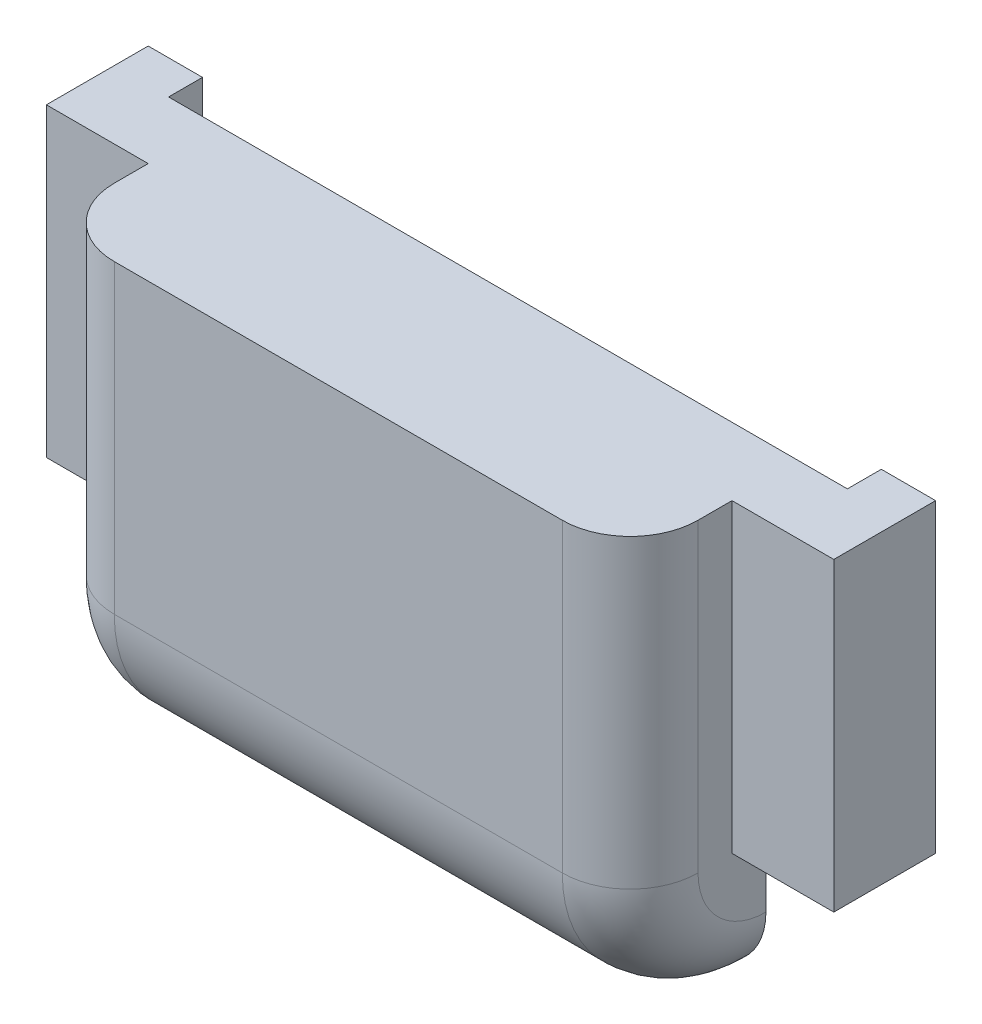
ISO-10303-21;
HEADER;
FILE_DESCRIPTION(('STEP AP214'),'2;1');
FILE_NAME('part.step','',(''),(''),'','','');
FILE_SCHEMA(('AUTOMOTIVE_DESIGN { 1 0 10303 214 1 1 1 1 }'));
ENDSEC;
DATA;
#1=APPLICATION_CONTEXT('core data for automotive mechanical design processes');
#2=APPLICATION_PROTOCOL_DEFINITION('international standard','automotive_design',2000,#1);
#3=PRODUCT_CONTEXT('',#1,'mechanical');
#4=PRODUCT('Part','Part','',(#3));
#5=PRODUCT_RELATED_PRODUCT_CATEGORY('part','',(#4));
#6=PRODUCT_DEFINITION_FORMATION('','',#4);
#7=PRODUCT_DEFINITION_CONTEXT('part definition',#1,'design');
#8=PRODUCT_DEFINITION('design','',#6,#7);
#9=PRODUCT_DEFINITION_SHAPE('','',#8);
#10=(LENGTH_UNIT() NAMED_UNIT(*) SI_UNIT(.MILLI.,.METRE.));
#11=(NAMED_UNIT(*) PLANE_ANGLE_UNIT() SI_UNIT($,.RADIAN.));
#12=(NAMED_UNIT(*) SI_UNIT($,.STERADIAN.) SOLID_ANGLE_UNIT());
#13=UNCERTAINTY_MEASURE_WITH_UNIT(LENGTH_MEASURE(1.E-05),#10,'distance_accuracy_value','');
#14=(GEOMETRIC_REPRESENTATION_CONTEXT(3) GLOBAL_UNCERTAINTY_ASSIGNED_CONTEXT((#13)) GLOBAL_UNIT_ASSIGNED_CONTEXT((#10,
#11,#12)) REPRESENTATION_CONTEXT('',''));
#15=CARTESIAN_POINT('',(0.,0.,0.));
#16=DIRECTION('',(0.,0.,1.));
#17=DIRECTION('',(1.,0.,0.));
#18=AXIS2_PLACEMENT_3D('',#15,#16,#17);
#19=CARTESIAN_POINT('',(0.,0.,0.));
#20=DIRECTION('',(0.,0.,1.));
#21=DIRECTION('',(1.,0.,0.));
#22=AXIS2_PLACEMENT_3D('',#19,#20,#21);
#23=PLANE('',#22);
#24=DIRECTION('',(-1.,0.,0.));
#25=VECTOR('',#24,1.);
#26=CARTESIAN_POINT('',(5.8,-1.25,0.));
#27=LINE('',#26,#25);
#28=CARTESIAN_POINT('',(5.8,-1.25,0.));
#29=VERTEX_POINT('',#28);
#30=CARTESIAN_POINT('',(5.,-1.25,0.));
#31=VERTEX_POINT('',#30);
#32=EDGE_CURVE('E257',#29,#31,#27,.T.);
#33=ORIENTED_EDGE('',*,*,#32,.T.);
#34=DIRECTION('',(0.,-1.,0.));
#35=VECTOR('',#34,1.);
#36=CARTESIAN_POINT('',(5.,3.25,0.));
#37=LINE('',#36,#35);
#38=CARTESIAN_POINT('',(5.,3.25,0.));
#39=VERTEX_POINT('',#38);
#40=EDGE_CURVE('E581',#39,#31,#37,.T.);
#41=ORIENTED_EDGE('',*,*,#40,.F.);
#42=DIRECTION('',(-1.,0.,0.));
#43=VECTOR('',#42,1.);
#44=CARTESIAN_POINT('',(-4.3,3.25,0.));
#45=LINE('',#44,#43);
#46=CARTESIAN_POINT('',(5.8,3.25,0.));
#47=VERTEX_POINT('',#46);
#48=EDGE_CURVE('E274',#47,#39,#45,.T.);
#49=ORIENTED_EDGE('',*,*,#48,.F.);
#50=DIRECTION('',(0.,1.,0.));
#51=VECTOR('',#50,1.);
#52=CARTESIAN_POINT('',(5.8,-1.25,0.));
#53=LINE('',#52,#51);
#54=EDGE_CURVE('E237',#29,#47,#53,.T.);
#55=ORIENTED_EDGE('',*,*,#54,.F.);
#56=EDGE_LOOP('',(#33,#41,#49,#55));
#57=FACE_BOUND('',#56,.T.);
#58=ADVANCED_FACE('F41',(#57),#23,.F.);
#59=CARTESIAN_POINT('',(-4.3,3.25,3.));
#60=DIRECTION('',(1.,0.,0.));
#61=DIRECTION('',(0.,0.,-1.));
#62=AXIS2_PLACEMENT_3D('',#59,#60,#61);
#63=PLANE('',#62);
#64=DIRECTION('',(0.,1.,0.));
#65=VECTOR('',#64,1.);
#66=CARTESIAN_POINT('',(-4.3,-2.25,1.));
#67=LINE('',#66,#65);
#68=CARTESIAN_POINT('',(-4.3,-2.25,1.));
#69=VERTEX_POINT('',#68);
#70=CARTESIAN_POINT('',(-4.3,-1.25,1.));
#71=VERTEX_POINT('',#70);
#72=EDGE_CURVE('E201',#69,#71,#67,.T.);
#73=ORIENTED_EDGE('',*,*,#72,.F.);
#74=CARTESIAN_POINT('',(-4.3,-1.25,1.));
#75=DIRECTION('',(1.,0.,0.));
#76=DIRECTION('',(0.,0.,-1.));
#77=AXIS2_PLACEMENT_3D('',#74,#75,#76);
#78=CIRCLE('',#77,1.);
#79=CARTESIAN_POINT('',(-4.3,-1.25,2.));
#80=VERTEX_POINT('',#79);
#81=EDGE_CURVE('E315',#69,#80,#78,.F.);
#82=ORIENTED_EDGE('',*,*,#81,.T.);
#83=DIRECTION('',(0.,-1.,0.));
#84=VECTOR('',#83,1.);
#85=CARTESIAN_POINT('',(-4.3,3.25,2.));
#86=LINE('',#85,#84);
#87=CARTESIAN_POINT('',(-4.3,3.25,2.));
#88=VERTEX_POINT('',#87);
#89=EDGE_CURVE('E306',#80,#88,#86,.F.);
#90=ORIENTED_EDGE('',*,*,#89,.T.);
#91=DIRECTION('',(0.,0.,-1.));
#92=VECTOR('',#91,1.);
#93=CARTESIAN_POINT('',(-4.3,3.25,3.));
#94=LINE('',#93,#92);
#95=CARTESIAN_POINT('',(-4.3,3.25,1.5));
#96=VERTEX_POINT('',#95);
#97=EDGE_CURVE('E273',#88,#96,#94,.T.);
#98=ORIENTED_EDGE('',*,*,#97,.T.);
#99=DIRECTION('',(0.,1.,0.));
#100=VECTOR('',#99,1.);
#101=CARTESIAN_POINT('',(-4.3,3.25,1.5));
#102=LINE('',#101,#100);
#103=CARTESIAN_POINT('',(-4.3,-1.25,1.5));
#104=VERTEX_POINT('',#103);
#105=EDGE_CURVE('E211',#104,#96,#102,.T.);
#106=ORIENTED_EDGE('',*,*,#105,.F.);
#107=DIRECTION('',(0.,0.,1.));
#108=VECTOR('',#107,1.);
#109=CARTESIAN_POINT('',(-4.3,-1.25,0.));
#110=LINE('',#109,#108);
#111=EDGE_CURVE('E222',#71,#104,#110,.T.);
#112=ORIENTED_EDGE('',*,*,#111,.F.);
#113=EDGE_LOOP('',(#73,#82,#90,#98,#106,#112));
#114=FACE_BOUND('',#113,.T.);
#115=ADVANCED_FACE('F338',(#114),#63,.F.);
#116=CARTESIAN_POINT('',(4.3,3.25,3.));
#117=DIRECTION('',(-1.,0.,0.));
#118=DIRECTION('',(0.,0.,1.));
#119=AXIS2_PLACEMENT_3D('',#116,#117,#118);
#120=PLANE('',#119);
#121=DIRECTION('',(0.,-1.,0.));
#122=VECTOR('',#121,1.);
#123=CARTESIAN_POINT('',(4.3,-1.25,1.));
#124=LINE('',#123,#122);
#125=CARTESIAN_POINT('',(4.3,-1.25,1.));
#126=VERTEX_POINT('',#125);
#127=CARTESIAN_POINT('',(4.3,-2.25,1.));
#128=VERTEX_POINT('',#127);
#129=EDGE_CURVE('E198',#126,#128,#124,.T.);
#130=ORIENTED_EDGE('',*,*,#129,.F.);
#131=DIRECTION('',(0.,0.,-1.));
#132=VECTOR('',#131,1.);
#133=CARTESIAN_POINT('',(4.3,-1.25,0.));
#134=LINE('',#133,#132);
#135=CARTESIAN_POINT('',(4.3,-1.25,1.5));
#136=VERTEX_POINT('',#135);
#137=EDGE_CURVE('E242',#136,#126,#134,.T.);
#138=ORIENTED_EDGE('',*,*,#137,.F.);
#139=DIRECTION('',(0.,-1.,0.));
#140=VECTOR('',#139,1.);
#141=CARTESIAN_POINT('',(4.3,-1.25,1.5));
#142=LINE('',#141,#140);
#143=CARTESIAN_POINT('',(4.3,3.25,1.5));
#144=VERTEX_POINT('',#143);
#145=EDGE_CURVE('E236',#144,#136,#142,.T.);
#146=ORIENTED_EDGE('',*,*,#145,.F.);
#147=DIRECTION('',(0.,0.,-1.));
#148=VECTOR('',#147,1.);
#149=CARTESIAN_POINT('',(4.3,3.25,3.));
#150=LINE('',#149,#148);
#151=CARTESIAN_POINT('',(4.3,3.25,2.));
#152=VERTEX_POINT('',#151);
#153=EDGE_CURVE('E280',#152,#144,#150,.T.);
#154=ORIENTED_EDGE('',*,*,#153,.F.);
#155=DIRECTION('',(0.,1.,0.));
#156=VECTOR('',#155,1.);
#157=CARTESIAN_POINT('',(4.3,-1.25,2.));
#158=LINE('',#157,#156);
#159=CARTESIAN_POINT('',(4.3,-1.25,2.));
#160=VERTEX_POINT('',#159);
#161=EDGE_CURVE('E289',#152,#160,#158,.F.);
#162=ORIENTED_EDGE('',*,*,#161,.T.);
#163=CARTESIAN_POINT('',(4.3,-1.25,1.));
#164=DIRECTION('',(-1.,0.,0.));
#165=DIRECTION('',(0.,0.,1.));
#166=AXIS2_PLACEMENT_3D('',#163,#164,#165);
#167=CIRCLE('',#166,1.);
#168=EDGE_CURVE('E292',#160,#128,#167,.F.);
#169=ORIENTED_EDGE('',*,*,#168,.T.);
#170=EDGE_LOOP('',(#130,#138,#146,#154,#162,#169));
#171=FACE_BOUND('',#170,.T.);
#172=ADVANCED_FACE('F367',(#171),#120,.F.);
#173=CARTESIAN_POINT('',(-4.3,3.25,3.));
#174=DIRECTION('',(0.,-1.,0.));
#175=DIRECTION('',(0.,0.,-1.));
#176=AXIS2_PLACEMENT_3D('',#173,#174,#175);
#177=PLANE('',#176);
#178=ORIENTED_EDGE('',*,*,#48,.T.);
#179=DIRECTION('',(0.,0.,-1.));
#180=VECTOR('',#179,1.);
#181=CARTESIAN_POINT('',(5.,3.25,0.5));
#182=LINE('',#181,#180);
#183=CARTESIAN_POINT('',(5.,3.25,0.5));
#184=VERTEX_POINT('',#183);
#185=EDGE_CURVE('E190',#184,#39,#182,.T.);
#186=ORIENTED_EDGE('',*,*,#185,.F.);
#187=DIRECTION('',(1.,0.,0.));
#188=VECTOR('',#187,1.);
#189=CARTESIAN_POINT('',(5.,3.25,0.5));
#190=LINE('',#189,#188);
#191=CARTESIAN_POINT('',(-5.,3.25,0.5));
#192=VERTEX_POINT('',#191);
#193=EDGE_CURVE('E172',#192,#184,#190,.T.);
#194=ORIENTED_EDGE('',*,*,#193,.F.);
#195=DIRECTION('',(0.,0.,-1.));
#196=VECTOR('',#195,1.);
#197=CARTESIAN_POINT('',(-5.,3.25,0.5));
#198=LINE('',#197,#196);
#199=CARTESIAN_POINT('',(-5.,3.25,0.));
#200=VERTEX_POINT('',#199);
#201=EDGE_CURVE('E169',#192,#200,#198,.T.);
#202=ORIENTED_EDGE('',*,*,#201,.T.);
#203=CARTESIAN_POINT('',(-5.8,3.25,0.));
#204=VERTEX_POINT('',#203);
#205=EDGE_CURVE('E269',#200,#204,#45,.T.);
#206=ORIENTED_EDGE('',*,*,#205,.T.);
#207=DIRECTION('',(0.,0.,-1.));
#208=VECTOR('',#207,1.);
#209=CARTESIAN_POINT('',(-5.8,3.25,0.));
#210=LINE('',#209,#208);
#211=CARTESIAN_POINT('',(-5.8,3.25,1.5));
#212=VERTEX_POINT('',#211);
#213=EDGE_CURVE('E217',#212,#204,#210,.T.);
#214=ORIENTED_EDGE('',*,*,#213,.F.);
#215=DIRECTION('',(1.,0.,0.));
#216=VECTOR('',#215,1.);
#217=CARTESIAN_POINT('',(-5.8,3.25,1.5));
#218=LINE('',#217,#216);
#219=EDGE_CURVE('E221',#212,#96,#218,.T.);
#220=ORIENTED_EDGE('',*,*,#219,.T.);
#221=ORIENTED_EDGE('',*,*,#97,.F.);
#222=CARTESIAN_POINT('',(-3.3,3.25,2.));
#223=DIRECTION('',(0.,-1.,0.));
#224=DIRECTION('',(0.,0.,-1.));
#225=AXIS2_PLACEMENT_3D('',#222,#223,#224);
#226=CIRCLE('',#225,1.);
#227=CARTESIAN_POINT('',(-3.3,3.25,3.));
#228=VERTEX_POINT('',#227);
#229=EDGE_CURVE('E11',#88,#228,#226,.F.);
#230=ORIENTED_EDGE('',*,*,#229,.T.);
#231=DIRECTION('',(-1.,0.,0.));
#232=VECTOR('',#231,1.);
#233=CARTESIAN_POINT('',(-4.3,3.25,3.));
#234=LINE('',#233,#232);
#235=CARTESIAN_POINT('',(3.3,3.25,3.));
#236=VERTEX_POINT('',#235);
#237=EDGE_CURVE('E270',#236,#228,#234,.T.);
#238=ORIENTED_EDGE('',*,*,#237,.F.);
#239=CARTESIAN_POINT('',(3.3,3.25,2.));
#240=DIRECTION('',(0.,-1.,0.));
#241=DIRECTION('',(0.,0.,-1.));
#242=AXIS2_PLACEMENT_3D('',#239,#240,#241);
#243=CIRCLE('',#242,1.);
#244=EDGE_CURVE('E303',#236,#152,#243,.F.);
#245=ORIENTED_EDGE('',*,*,#244,.T.);
#246=ORIENTED_EDGE('',*,*,#153,.T.);
#247=DIRECTION('',(-1.,0.,0.));
#248=VECTOR('',#247,1.);
#249=CARTESIAN_POINT('',(5.8,3.25,1.5));
#250=LINE('',#249,#248);
#251=CARTESIAN_POINT('',(5.8,3.25,1.5));
#252=VERTEX_POINT('',#251);
#253=EDGE_CURVE('E265',#252,#144,#250,.T.);
#254=ORIENTED_EDGE('',*,*,#253,.F.);
#255=DIRECTION('',(0.,0.,1.));
#256=VECTOR('',#255,1.);
#257=CARTESIAN_POINT('',(5.8,3.25,0.));
#258=LINE('',#257,#256);
#259=EDGE_CURVE('E241',#47,#252,#258,.T.);
#260=ORIENTED_EDGE('',*,*,#259,.F.);
#261=EDGE_LOOP('',(#178,#186,#194,#202,#206,#214,#220,#221,#230,#238,#245,#246,#254,#260));
#262=FACE_BOUND('',#261,.T.);
#263=ADVANCED_FACE('F340',(#262),#177,.F.);
#264=CARTESIAN_POINT('',(0.,0.,3.));
#265=DIRECTION('',(0.,0.,1.));
#266=DIRECTION('',(1.,0.,0.));
#267=AXIS2_PLACEMENT_3D('',#264,#265,#266);
#268=PLANE('',#267);
#269=ORIENTED_EDGE('',*,*,#237,.T.);
#270=DIRECTION('',(0.,-1.,0.));
#271=VECTOR('',#270,1.);
#272=CARTESIAN_POINT('',(-3.3,-1.25,3.));
#273=LINE('',#272,#271);
#274=CARTESIAN_POINT('',(-3.3,-1.25,3.));
#275=VERTEX_POINT('',#274);
#276=EDGE_CURVE('E51',#228,#275,#273,.T.);
#277=ORIENTED_EDGE('',*,*,#276,.T.);
#278=DIRECTION('',(1.,0.,0.));
#279=VECTOR('',#278,1.);
#280=CARTESIAN_POINT('',(4.3,-1.25,3.));
#281=LINE('',#280,#279);
#282=CARTESIAN_POINT('',(3.3,-1.25,3.));
#283=VERTEX_POINT('',#282);
#284=EDGE_CURVE('E283',#275,#283,#281,.T.);
#285=ORIENTED_EDGE('',*,*,#284,.T.);
#286=DIRECTION('',(0.,1.,0.));
#287=VECTOR('',#286,1.);
#288=CARTESIAN_POINT('',(3.3,3.25,3.));
#289=LINE('',#288,#287);
#290=EDGE_CURVE('E300',#283,#236,#289,.T.);
#291=ORIENTED_EDGE('',*,*,#290,.T.);
#292=EDGE_LOOP('',(#269,#277,#285,#291));
#293=FACE_BOUND('',#292,.T.);
#294=ADVANCED_FACE('F372',(#293),#268,.T.);
#295=ORIENTED_EDGE('',*,*,#205,.F.);
#296=DIRECTION('',(0.,1.,0.));
#297=VECTOR('',#296,1.);
#298=CARTESIAN_POINT('',(-5.,3.25,0.));
#299=LINE('',#298,#297);
#300=CARTESIAN_POINT('',(-5.,-1.25,0.));
#301=VERTEX_POINT('',#300);
#302=EDGE_CURVE('E384',#301,#200,#299,.T.);
#303=ORIENTED_EDGE('',*,*,#302,.F.);
#304=CARTESIAN_POINT('',(-5.8,-1.25,0.));
#305=VERTEX_POINT('',#304);
#306=EDGE_CURVE('E184',#301,#305,#27,.T.);
#307=ORIENTED_EDGE('',*,*,#306,.T.);
#308=DIRECTION('',(0.,-1.,0.));
#309=VECTOR('',#308,1.);
#310=CARTESIAN_POINT('',(-5.8,3.25,0.));
#311=LINE('',#310,#309);
#312=EDGE_CURVE('E206',#204,#305,#311,.T.);
#313=ORIENTED_EDGE('',*,*,#312,.F.);
#314=EDGE_LOOP('',(#295,#303,#307,#313));
#315=FACE_BOUND('',#314,.T.);
#316=ADVANCED_FACE('F363',(#315),#23,.F.);
#317=CARTESIAN_POINT('',(0.,-1.25,1.));
#318=DIRECTION('',(-1.,0.,0.));
#319=DIRECTION('',(0.,0.,1.));
#320=AXIS2_PLACEMENT_3D('',#317,#318,#319);
#321=CYLINDRICAL_SURFACE('',#320,2.);
#322=ORIENTED_EDGE('',*,*,#284,.F.);
#323=CARTESIAN_POINT('',(-3.3,-1.25,1.));
#324=DIRECTION('',(1.,0.,0.));
#325=DIRECTION('',(0.,0.,-1.));
#326=AXIS2_PLACEMENT_3D('',#323,#324,#325);
#327=CIRCLE('',#326,2.);
#328=CARTESIAN_POINT('',(-3.3,-3.25,1.));
#329=VERTEX_POINT('',#328);
#330=EDGE_CURVE('E318',#275,#329,#327,.T.);
#331=ORIENTED_EDGE('',*,*,#330,.T.);
#332=DIRECTION('',(1.,0.,0.));
#333=VECTOR('',#332,1.);
#334=CARTESIAN_POINT('',(-4.3,-3.25,1.));
#335=LINE('',#334,#333);
#336=CARTESIAN_POINT('',(3.3,-3.25,1.));
#337=VERTEX_POINT('',#336);
#338=EDGE_CURVE('E286',#337,#329,#335,.F.);
#339=ORIENTED_EDGE('',*,*,#338,.F.);
#340=CARTESIAN_POINT('',(3.3,-1.25,1.));
#341=DIRECTION('',(-1.,0.,0.));
#342=DIRECTION('',(0.,0.,1.));
#343=AXIS2_PLACEMENT_3D('',#340,#341,#342);
#344=CIRCLE('',#343,2.);
#345=EDGE_CURVE('E296',#337,#283,#344,.T.);
#346=ORIENTED_EDGE('',*,*,#345,.T.);
#347=EDGE_LOOP('',(#322,#331,#339,#346));
#348=FACE_BOUND('',#347,.T.);
#349=ADVANCED_FACE('F371',(#348),#321,.T.);
#350=CARTESIAN_POINT('',(5.8,-1.25,1.5));
#351=DIRECTION('',(0.,0.,-1.));
#352=DIRECTION('',(-1.,0.,0.));
#353=AXIS2_PLACEMENT_3D('',#350,#351,#352);
#354=PLANE('',#353);
#355=ORIENTED_EDGE('',*,*,#145,.T.);
#356=DIRECTION('',(-1.,0.,0.));
#357=VECTOR('',#356,1.);
#358=CARTESIAN_POINT('',(5.8,-1.25,1.5));
#359=LINE('',#358,#357);
#360=CARTESIAN_POINT('',(5.8,-1.25,1.5));
#361=VERTEX_POINT('',#360);
#362=EDGE_CURVE('E261',#361,#136,#359,.T.);
#363=ORIENTED_EDGE('',*,*,#362,.F.);
#364=DIRECTION('',(0.,-1.,0.));
#365=VECTOR('',#364,1.);
#366=CARTESIAN_POINT('',(5.8,-1.25,1.5));
#367=LINE('',#366,#365);
#368=EDGE_CURVE('E245',#252,#361,#367,.T.);
#369=ORIENTED_EDGE('',*,*,#368,.F.);
#370=ORIENTED_EDGE('',*,*,#253,.T.);
#371=EDGE_LOOP('',(#355,#363,#369,#370));
#372=FACE_BOUND('',#371,.T.);
#373=ADVANCED_FACE('F378',(#372),#354,.F.);
#374=CARTESIAN_POINT('',(5.8,-1.25,0.));
#375=DIRECTION('',(0.,1.,0.));
#376=DIRECTION('',(0.,0.,1.));
#377=AXIS2_PLACEMENT_3D('',#374,#375,#376);
#378=PLANE('',#377);
#379=DIRECTION('',(-1.,0.,0.));
#380=VECTOR('',#379,1.);
#381=CARTESIAN_POINT('',(5.,-1.25,0.5));
#382=LINE('',#381,#380);
#383=CARTESIAN_POINT('',(5.,-1.25,0.5));
#384=VERTEX_POINT('',#383);
#385=CARTESIAN_POINT('',(-5.,-1.25,0.5));
#386=VERTEX_POINT('',#385);
#387=EDGE_CURVE('E173',#384,#386,#382,.T.);
#388=ORIENTED_EDGE('',*,*,#387,.F.);
#389=DIRECTION('',(0.,0.,-1.));
#390=VECTOR('',#389,1.);
#391=CARTESIAN_POINT('',(5.,-1.25,0.5));
#392=LINE('',#391,#390);
#393=EDGE_CURVE('E186',#384,#31,#392,.T.);
#394=ORIENTED_EDGE('',*,*,#393,.T.);
#395=ORIENTED_EDGE('',*,*,#32,.F.);
#396=DIRECTION('',(0.,0.,-1.));
#397=VECTOR('',#396,1.);
#398=CARTESIAN_POINT('',(5.8,-1.25,0.));
#399=LINE('',#398,#397);
#400=EDGE_CURVE('E248',#361,#29,#399,.T.);
#401=ORIENTED_EDGE('',*,*,#400,.F.);
#402=ORIENTED_EDGE('',*,*,#362,.T.);
#403=ORIENTED_EDGE('',*,*,#137,.T.);
#404=DIRECTION('',(1.,0.,0.));
#405=VECTOR('',#404,1.);
#406=CARTESIAN_POINT('',(-4.3,-1.25,1.));
#407=LINE('',#406,#405);
#408=EDGE_CURVE('E195',#71,#126,#407,.T.);
#409=ORIENTED_EDGE('',*,*,#408,.F.);
#410=ORIENTED_EDGE('',*,*,#111,.T.);
#411=DIRECTION('',(1.,0.,0.));
#412=VECTOR('',#411,1.);
#413=CARTESIAN_POINT('',(-5.8,-1.25,1.5));
#414=LINE('',#413,#412);
#415=CARTESIAN_POINT('',(-5.8,-1.25,1.5));
#416=VERTEX_POINT('',#415);
#417=EDGE_CURVE('E232',#416,#104,#414,.T.);
#418=ORIENTED_EDGE('',*,*,#417,.F.);
#419=DIRECTION('',(0.,0.,1.));
#420=VECTOR('',#419,1.);
#421=CARTESIAN_POINT('',(-5.8,-1.25,0.));
#422=LINE('',#421,#420);
#423=EDGE_CURVE('E210',#305,#416,#422,.T.);
#424=ORIENTED_EDGE('',*,*,#423,.F.);
#425=ORIENTED_EDGE('',*,*,#306,.F.);
#426=DIRECTION('',(0.,0.,-1.));
#427=VECTOR('',#426,1.);
#428=CARTESIAN_POINT('',(-5.,-1.25,0.5));
#429=LINE('',#428,#427);
#430=EDGE_CURVE('E166',#386,#301,#429,.T.);
#431=ORIENTED_EDGE('',*,*,#430,.F.);
#432=EDGE_LOOP('',(#388,#394,#395,#401,#402,#403,#409,#410,#418,#424,#425,#431));
#433=FACE_BOUND('',#432,.T.);
#434=ADVANCED_FACE('F182',(#433),#378,.F.);
#435=CARTESIAN_POINT('',(5.8,0.,0.));
#436=DIRECTION('',(1.,0.,0.));
#437=DIRECTION('',(0.,0.,-1.));
#438=AXIS2_PLACEMENT_3D('',#435,#436,#437);
#439=PLANE('',#438);
#440=ORIENTED_EDGE('',*,*,#54,.T.);
#441=ORIENTED_EDGE('',*,*,#259,.T.);
#442=ORIENTED_EDGE('',*,*,#368,.T.);
#443=ORIENTED_EDGE('',*,*,#400,.T.);
#444=EDGE_LOOP('',(#440,#441,#442,#443));
#445=FACE_BOUND('',#444,.T.);
#446=ADVANCED_FACE('F398',(#445),#439,.T.);
#447=CARTESIAN_POINT('',(-5.8,3.25,1.5));
#448=DIRECTION('',(0.,0.,-1.));
#449=DIRECTION('',(0.,1.,0.));
#450=AXIS2_PLACEMENT_3D('',#447,#448,#449);
#451=PLANE('',#450);
#452=ORIENTED_EDGE('',*,*,#105,.T.);
#453=ORIENTED_EDGE('',*,*,#219,.F.);
#454=DIRECTION('',(0.,1.,0.));
#455=VECTOR('',#454,1.);
#456=CARTESIAN_POINT('',(-5.8,3.25,1.5));
#457=LINE('',#456,#455);
#458=EDGE_CURVE('E214',#416,#212,#457,.T.);
#459=ORIENTED_EDGE('',*,*,#458,.F.);
#460=ORIENTED_EDGE('',*,*,#417,.T.);
#461=EDGE_LOOP('',(#452,#453,#459,#460));
#462=FACE_BOUND('',#461,.T.);
#463=ADVANCED_FACE('F345',(#462),#451,.F.);
#464=CARTESIAN_POINT('',(-5.8,0.,0.));
#465=DIRECTION('',(-1.,0.,0.));
#466=DIRECTION('',(0.,0.,1.));
#467=AXIS2_PLACEMENT_3D('',#464,#465,#466);
#468=PLANE('',#467);
#469=ORIENTED_EDGE('',*,*,#312,.T.);
#470=ORIENTED_EDGE('',*,*,#423,.T.);
#471=ORIENTED_EDGE('',*,*,#458,.T.);
#472=ORIENTED_EDGE('',*,*,#213,.T.);
#473=EDGE_LOOP('',(#469,#470,#471,#472));
#474=FACE_BOUND('',#473,.T.);
#475=ADVANCED_FACE('F388',(#474),#468,.T.);
#476=CARTESIAN_POINT('',(3.3,0.,2.));
#477=DIRECTION('',(0.,-1.,0.));
#478=DIRECTION('',(0.,0.,-1.));
#479=AXIS2_PLACEMENT_3D('',#476,#477,#478);
#480=CYLINDRICAL_SURFACE('',#479,1.);
#481=ORIENTED_EDGE('',*,*,#244,.F.);
#482=ORIENTED_EDGE('',*,*,#290,.F.);
#483=CARTESIAN_POINT('',(3.3,-1.25,2.));
#484=DIRECTION('',(0.,-1.,0.));
#485=DIRECTION('',(0.,0.,-1.));
#486=AXIS2_PLACEMENT_3D('',#483,#484,#485);
#487=CIRCLE('',#486,1.);
#488=EDGE_CURVE('E225',#160,#283,#487,.T.);
#489=ORIENTED_EDGE('',*,*,#488,.F.);
#490=ORIENTED_EDGE('',*,*,#161,.F.);
#491=EDGE_LOOP('',(#481,#482,#489,#490));
#492=FACE_BOUND('',#491,.T.);
#493=ADVANCED_FACE('F390',(#492),#480,.T.);
#494=CARTESIAN_POINT('',(3.3,-1.25,1.));
#495=DIRECTION('',(-1.,0.,0.));
#496=DIRECTION('',(0.,0.,1.));
#497=AXIS2_PLACEMENT_3D('',#494,#495,#496);
#498=DEGENERATE_TOROIDAL_SURFACE('',#497,1.,1.,.T.);
#499=ORIENTED_EDGE('',*,*,#488,.T.);
#500=ORIENTED_EDGE('',*,*,#345,.F.);
#501=CARTESIAN_POINT('',(3.3,-2.25,1.));
#502=DIRECTION('',(0.,0.,-1.));
#503=DIRECTION('',(-1.,0.,0.));
#504=AXIS2_PLACEMENT_3D('',#501,#502,#503);
#505=CIRCLE('',#504,1.);
#506=EDGE_CURVE('E307',#128,#337,#505,.T.);
#507=ORIENTED_EDGE('',*,*,#506,.F.);
#508=ORIENTED_EDGE('',*,*,#168,.F.);
#509=EDGE_LOOP('',(#499,#500,#507,#508));
#510=FACE_BOUND('',#509,.T.);
#511=ADVANCED_FACE('F395',(#510),#498,.T.);
#512=CARTESIAN_POINT('',(-3.3,0.,2.));
#513=DIRECTION('',(0.,1.,0.));
#514=DIRECTION('',(0.,0.,1.));
#515=AXIS2_PLACEMENT_3D('',#512,#513,#514);
#516=CYLINDRICAL_SURFACE('',#515,1.);
#517=ORIENTED_EDGE('',*,*,#229,.F.);
#518=ORIENTED_EDGE('',*,*,#89,.F.);
#519=CARTESIAN_POINT('',(-3.3,-1.25,2.));
#520=DIRECTION('',(0.,-1.,0.));
#521=DIRECTION('',(0.,0.,-1.));
#522=AXIS2_PLACEMENT_3D('',#519,#520,#521);
#523=CIRCLE('',#522,1.);
#524=EDGE_CURVE('E45',#275,#80,#523,.T.);
#525=ORIENTED_EDGE('',*,*,#524,.F.);
#526=ORIENTED_EDGE('',*,*,#276,.F.);
#527=EDGE_LOOP('',(#517,#518,#525,#526));
#528=FACE_BOUND('',#527,.T.);
#529=ADVANCED_FACE('F43',(#528),#516,.T.);
#530=CARTESIAN_POINT('',(-3.3,-1.25,1.));
#531=DIRECTION('',(1.,0.,0.));
#532=DIRECTION('',(0.,0.,-1.));
#533=AXIS2_PLACEMENT_3D('',#530,#531,#532);
#534=DEGENERATE_TOROIDAL_SURFACE('',#533,1.,1.,.T.);
#535=ORIENTED_EDGE('',*,*,#524,.T.);
#536=ORIENTED_EDGE('',*,*,#81,.F.);
#537=CARTESIAN_POINT('',(-3.3,-2.25,1.));
#538=DIRECTION('',(0.,0.,-1.));
#539=DIRECTION('',(-1.,0.,0.));
#540=AXIS2_PLACEMENT_3D('',#537,#538,#539);
#541=CIRCLE('',#540,1.);
#542=EDGE_CURVE('E205',#329,#69,#541,.T.);
#543=ORIENTED_EDGE('',*,*,#542,.F.);
#544=ORIENTED_EDGE('',*,*,#330,.F.);
#545=EDGE_LOOP('',(#535,#536,#543,#544));
#546=FACE_BOUND('',#545,.T.);
#547=ADVANCED_FACE('F333',(#546),#534,.T.);
#548=CARTESIAN_POINT('',(3.3,-2.25,1.));
#549=DIRECTION('',(0.,0.,-1.));
#550=DIRECTION('',(-1.,0.,0.));
#551=AXIS2_PLACEMENT_3D('',#548,#549,#550);
#552=PLANE('',#551);
#553=ORIENTED_EDGE('',*,*,#408,.T.);
#554=ORIENTED_EDGE('',*,*,#129,.T.);
#555=ORIENTED_EDGE('',*,*,#506,.T.);
#556=ORIENTED_EDGE('',*,*,#338,.T.);
#557=ORIENTED_EDGE('',*,*,#542,.T.);
#558=ORIENTED_EDGE('',*,*,#72,.T.);
#559=EDGE_LOOP('',(#553,#554,#555,#556,#557,#558));
#560=FACE_BOUND('',#559,.T.);
#561=ADVANCED_FACE('F349',(#560),#552,.T.);
#562=CARTESIAN_POINT('',(5.,3.25,0.5));
#563=DIRECTION('',(1.,0.,0.));
#564=DIRECTION('',(0.,1.,0.));
#565=AXIS2_PLACEMENT_3D('',#562,#563,#564);
#566=PLANE('',#565);
#567=ORIENTED_EDGE('',*,*,#40,.T.);
#568=ORIENTED_EDGE('',*,*,#393,.F.);
#569=DIRECTION('',(0.,-1.,0.));
#570=VECTOR('',#569,1.);
#571=CARTESIAN_POINT('',(5.,3.25,0.5));
#572=LINE('',#571,#570);
#573=EDGE_CURVE('E59',#184,#384,#572,.T.);
#574=ORIENTED_EDGE('',*,*,#573,.F.);
#575=ORIENTED_EDGE('',*,*,#185,.T.);
#576=EDGE_LOOP('',(#567,#568,#574,#575));
#577=FACE_BOUND('',#576,.T.);
#578=ADVANCED_FACE('F351',(#577),#566,.F.);
#579=CARTESIAN_POINT('',(-5.,3.25,0.5));
#580=DIRECTION('',(-1.,0.,0.));
#581=DIRECTION('',(0.,-1.,0.));
#582=AXIS2_PLACEMENT_3D('',#579,#580,#581);
#583=PLANE('',#582);
#584=ORIENTED_EDGE('',*,*,#302,.T.);
#585=ORIENTED_EDGE('',*,*,#201,.F.);
#586=DIRECTION('',(0.,1.,0.));
#587=VECTOR('',#586,1.);
#588=CARTESIAN_POINT('',(-5.,3.25,0.5));
#589=LINE('',#588,#587);
#590=EDGE_CURVE('E163',#386,#192,#589,.T.);
#591=ORIENTED_EDGE('',*,*,#590,.F.);
#592=ORIENTED_EDGE('',*,*,#430,.T.);
#593=EDGE_LOOP('',(#584,#585,#591,#592));
#594=FACE_BOUND('',#593,.T.);
#595=ADVANCED_FACE('F164',(#594),#583,.F.);
#596=CARTESIAN_POINT('',(0.,0.,0.5));
#597=DIRECTION('',(0.,0.,-1.));
#598=DIRECTION('',(-1.,0.,0.));
#599=AXIS2_PLACEMENT_3D('',#596,#597,#598);
#600=PLANE('',#599);
#601=ORIENTED_EDGE('',*,*,#573,.T.);
#602=ORIENTED_EDGE('',*,*,#387,.T.);
#603=ORIENTED_EDGE('',*,*,#590,.T.);
#604=ORIENTED_EDGE('',*,*,#193,.T.);
#605=EDGE_LOOP('',(#601,#602,#603,#604));
#606=FACE_BOUND('',#605,.T.);
#607=ADVANCED_FACE('F176',(#606),#600,.T.);
#608=CLOSED_SHELL('',(#58,#115,#172,#263,#294,#316,#349,#373,#434,#446,#463,#475,#493,#511,#529,
#547,#561,#578,#595,#607));
#609=MANIFOLD_SOLID_BREP('B2',#608);
#610=ADVANCED_BREP_SHAPE_REPRESENTATION('',(#18,#609),#14);
#611=SHAPE_DEFINITION_REPRESENTATION(#9,#610);
ENDSEC;
END-ISO-10303-21;
